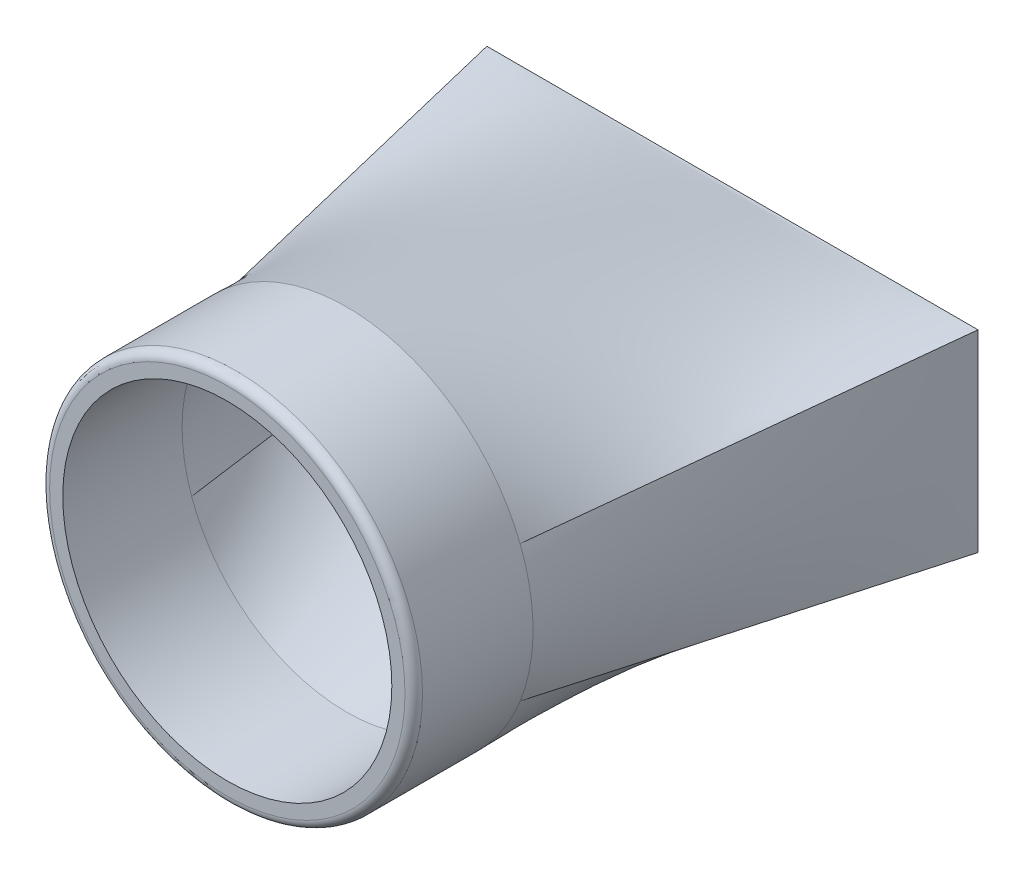
ISO-10303-21;
HEADER;
FILE_DESCRIPTION(('STEP AP214'),'2;1');
FILE_NAME('part.step','',(''),(''),'','','');
FILE_SCHEMA(('AUTOMOTIVE_DESIGN { 1 0 10303 214 1 1 1 1 }'));
ENDSEC;
DATA;
#1=APPLICATION_CONTEXT('core data for automotive mechanical design processes');
#2=APPLICATION_PROTOCOL_DEFINITION('international standard','automotive_design',2000,#1);
#3=PRODUCT_CONTEXT('',#1,'mechanical');
#4=PRODUCT('Part','Part','',(#3));
#5=PRODUCT_RELATED_PRODUCT_CATEGORY('part','',(#4));
#6=PRODUCT_DEFINITION_FORMATION('','',#4);
#7=PRODUCT_DEFINITION_CONTEXT('part definition',#1,'design');
#8=PRODUCT_DEFINITION('design','',#6,#7);
#9=PRODUCT_DEFINITION_SHAPE('','',#8);
#10=(LENGTH_UNIT() NAMED_UNIT(*) SI_UNIT(.MILLI.,.METRE.));
#11=(NAMED_UNIT(*) PLANE_ANGLE_UNIT() SI_UNIT($,.RADIAN.));
#12=(NAMED_UNIT(*) SI_UNIT($,.STERADIAN.) SOLID_ANGLE_UNIT());
#13=UNCERTAINTY_MEASURE_WITH_UNIT(LENGTH_MEASURE(1.E-05),#10,'distance_accuracy_value','');
#14=(GEOMETRIC_REPRESENTATION_CONTEXT(3) GLOBAL_UNCERTAINTY_ASSIGNED_CONTEXT((#13)) GLOBAL_UNIT_ASSIGNED_CONTEXT((#10,
#11,#12)) REPRESENTATION_CONTEXT('',''));
#15=CARTESIAN_POINT('',(0.,0.,0.));
#16=DIRECTION('',(0.,0.,1.));
#17=DIRECTION('',(1.,0.,0.));
#18=AXIS2_PLACEMENT_3D('',#15,#16,#17);
#19=CARTESIAN_POINT('',(0.,0.,-110.));
#20=DIRECTION('',(0.,0.,1.));
#21=DIRECTION('',(1.,0.,0.));
#22=AXIS2_PLACEMENT_3D('',#19,#20,#21);
#23=PLANE('',#22);
#24=CARTESIAN_POINT('',(-68.,0.,-110.));
#25=DIRECTION('',(0.,0.,-1.));
#26=DIRECTION('',(-1.,0.,0.));
#27=AXIS2_PLACEMENT_3D('',#24,#25,#26);
#28=CIRCLE('',#27,1.025);
#29=CARTESIAN_POINT('',(-69.025,0.,-110.));
#30=VERTEX_POINT('',#29);
#31=EDGE_CURVE('E597',#30,#30,#28,.T.);
#32=ORIENTED_EDGE('',*,*,#31,.F.);
#33=EDGE_LOOP('',(#32));
#34=FACE_BOUND('',#33,.T.);
#35=DIRECTION('',(0.,-1.,0.));
#36=VECTOR('',#35,1.);
#37=CARTESIAN_POINT('',(66.,23.5,-110.));
#38=LINE('',#37,#36);
#39=CARTESIAN_POINT('',(66.,23.5,-110.));
#40=VERTEX_POINT('',#39);
#41=CARTESIAN_POINT('',(66.,-23.5,-110.));
#42=VERTEX_POINT('',#41);
#43=EDGE_CURVE('E295',#40,#42,#38,.T.);
#44=ORIENTED_EDGE('',*,*,#43,.F.);
#45=DIRECTION('',(1.,0.,0.));
#46=VECTOR('',#45,1.);
#47=CARTESIAN_POINT('',(66.,23.5,-110.));
#48=LINE('',#47,#46);
#49=CARTESIAN_POINT('',(-66.,23.5,-110.));
#50=VERTEX_POINT('',#49);
#51=EDGE_CURVE('E403',#50,#40,#48,.T.);
#52=ORIENTED_EDGE('',*,*,#51,.F.);
#53=DIRECTION('',(0.,1.,0.));
#54=VECTOR('',#53,1.);
#55=CARTESIAN_POINT('',(-66.,23.5,-110.));
#56=LINE('',#55,#54);
#57=CARTESIAN_POINT('',(-66.,-23.5,-110.));
#58=VERTEX_POINT('',#57);
#59=EDGE_CURVE('E353',#58,#50,#56,.T.);
#60=ORIENTED_EDGE('',*,*,#59,.F.);
#61=DIRECTION('',(-1.,0.,0.));
#62=VECTOR('',#61,1.);
#63=CARTESIAN_POINT('',(66.,-23.5,-110.));
#64=LINE('',#63,#62);
#65=EDGE_CURVE('E306',#42,#58,#64,.T.);
#66=ORIENTED_EDGE('',*,*,#65,.F.);
#67=EDGE_LOOP('',(#44,#52,#60,#66));
#68=FACE_BOUND('',#67,.T.);
#69=DIRECTION('',(0.,1.,0.));
#70=VECTOR('',#69,1.);
#71=CARTESIAN_POINT('',(70.,27.5,-110.));
#72=LINE('',#71,#70);
#73=CARTESIAN_POINT('',(70.,-27.5,-110.));
#74=VERTEX_POINT('',#73);
#75=CARTESIAN_POINT('',(70.,27.5,-110.));
#76=VERTEX_POINT('',#75);
#77=EDGE_CURVE('E200',#74,#76,#72,.T.);
#78=ORIENTED_EDGE('',*,*,#77,.F.);
#79=DIRECTION('',(1.,0.,0.));
#80=VECTOR('',#79,1.);
#81=CARTESIAN_POINT('',(-70.,-27.5,-110.));
#82=LINE('',#81,#80);
#83=CARTESIAN_POINT('',(-70.,-27.5,-110.));
#84=VERTEX_POINT('',#83);
#85=EDGE_CURVE('E463',#84,#74,#82,.T.);
#86=ORIENTED_EDGE('',*,*,#85,.F.);
#87=DIRECTION('',(0.,-1.,0.));
#88=VECTOR('',#87,1.);
#89=CARTESIAN_POINT('',(-70.,27.5,-110.));
#90=LINE('',#89,#88);
#91=CARTESIAN_POINT('',(-70.,27.5,-110.));
#92=VERTEX_POINT('',#91);
#93=EDGE_CURVE('E466',#92,#84,#90,.T.);
#94=ORIENTED_EDGE('',*,*,#93,.F.);
#95=DIRECTION('',(-1.,0.,0.));
#96=VECTOR('',#95,1.);
#97=CARTESIAN_POINT('',(-70.,27.5,-110.));
#98=LINE('',#97,#96);
#99=EDGE_CURVE('E557',#76,#92,#98,.T.);
#100=ORIENTED_EDGE('',*,*,#99,.F.);
#101=EDGE_LOOP('',(#78,#86,#94,#100));
#102=FACE_BOUND('',#101,.T.);
#103=CARTESIAN_POINT('',(68.,-0.0100763748520707,-110.));
#104=DIRECTION('',(0.,0.,-1.));
#105=DIRECTION('',(-1.,0.,0.));
#106=AXIS2_PLACEMENT_3D('',#103,#104,#105);
#107=CIRCLE('',#106,1.025);
#108=CARTESIAN_POINT('',(66.975,-0.0100763748520707,-110.));
#109=VERTEX_POINT('',#108);
#110=EDGE_CURVE('E609',#109,#109,#107,.T.);
#111=ORIENTED_EDGE('',*,*,#110,.F.);
#112=EDGE_LOOP('',(#111));
#113=FACE_BOUND('',#112,.T.);
#114=ADVANCED_FACE('F104',(#34,#68,#102,#113),#23,.F.);
#115=CARTESIAN_POINT('',(-70.,27.5,-110.));
#116=CARTESIAN_POINT('',(-49.4694418763544,19.4344235942821,0.));
#117=CARTESIAN_POINT('',(-70.,22.9166666666667,-110.));
#118=CARTESIAN_POINT('',(-50.6538157253415,16.4196537968604,0.));
#119=CARTESIAN_POINT('',(-70.,18.3333333333333,-110.));
#120=CARTESIAN_POINT('',(-51.581145217019,13.2425985158665,0.));
#121=CARTESIAN_POINT('',(-70.,9.16666666666667,-110.));
#122=CARTESIAN_POINT('',(-52.8295129331014,6.70995682571048,0.));
#123=CARTESIAN_POINT('',(-70.,4.58333333333334,-110.));
#124=CARTESIAN_POINT('',(-53.15,3.35524339621296,0.));
#125=CARTESIAN_POINT('',(-70.,-4.58333333333333,-110.));
#126=CARTESIAN_POINT('',(-53.15,-3.35524339621295,0.));
#127=CARTESIAN_POINT('',(-70.,-9.16666666666666,-110.));
#128=CARTESIAN_POINT('',(-52.8295129331014,-6.70995682571047,0.));
#129=CARTESIAN_POINT('',(-70.,-18.3333333333333,-110.));
#130=CARTESIAN_POINT('',(-51.581145217019,-13.2425985158665,0.));
#131=CARTESIAN_POINT('',(-70.,-22.9166666666667,-110.));
#132=CARTESIAN_POINT('',(-50.6538157253416,-16.4196537968604,0.));
#133=CARTESIAN_POINT('',(-70.,-27.5,-110.));
#134=CARTESIAN_POINT('',(-49.4694418763545,-19.4344235942821,0.));
#135=B_SPLINE_SURFACE_WITH_KNOTS('',3,1,((#115,#116),(#117,#118),(#119,#120),(#121,#122),(#123,
#124),(#125,#126),(#127,#128),(#129,#130),(#131,#132),(#133,#134)),.UNSPECIFIED.,.F.,.F.,.F.,(4,
2,2,2,4),(2,2),(0.,0.25,0.5,0.75,1.),(0.,1.),.UNSPECIFIED.);
#136=DIRECTION('',(0.182998393222271,0.0718922259087497,0.980481053326352));
#137=VECTOR('',#136,1.);
#138=CARTESIAN_POINT('',(-59.7347209381772,-23.467211797141,-55.));
#139=LINE('',#138,#137);
#140=CARTESIAN_POINT('',(-49.4694796122722,-19.4344384310812,0.));
#141=VERTEX_POINT('',#140);
#142=EDGE_CURVE('E481',#84,#141,#139,.T.);
#143=CARTESIAN_POINT('',(0.,0.,0.));
#144=DIRECTION('',(0.,0.,1.));
#145=DIRECTION('',(1.,0.,0.));
#146=AXIS2_PLACEMENT_3D('',#143,#144,#145);
#147=CIRCLE('',#146,53.15);
#148=CARTESIAN_POINT('',(-49.4694701355687,19.4344347041715,0.));
#149=VERTEX_POINT('',#148);
#150=EDGE_CURVE('E188',#149,#141,#147,.T.);
#151=DIRECTION('',(-0.182998393222272,0.0718922259087497,-0.980481053326352));
#152=VECTOR('',#151,1.);
#153=CARTESIAN_POINT('',(-59.7347209381772,23.4672117971411,-55.));
#154=LINE('',#153,#152);
#155=EDGE_CURVE('E183',#149,#92,#154,.T.);
#156=ORIENTED_EDGE('',*,*,#93,.T.);
#157=ORIENTED_EDGE('',*,*,#142,.T.);
#158=ORIENTED_EDGE('',*,*,#150,.F.);
#159=ORIENTED_EDGE('',*,*,#155,.T.);
#160=EDGE_LOOP('',(#156,#157,#158,#159));
#161=FACE_BOUND('',#160,.T.);
#162=ADVANCED_FACE('F524',(#161),#135,.T.);
#163=CARTESIAN_POINT('',(-70.,-27.5,-110.));
#164=CARTESIAN_POINT('',(-49.4694418763545,-19.4344235942821,0.));
#165=CARTESIAN_POINT('',(-67.0833333333333,-27.5,-110.));
#166=CARTESIAN_POINT('',(-48.715749426999,-21.3529134653686,0.));
#167=CARTESIAN_POINT('',(-64.1666666666666,-27.5,-110.));
#168=CARTESIAN_POINT('',(-47.8203649167358,-23.3043698347779,0.));
#169=CARTESIAN_POINT('',(-58.3333333333333,-27.5,-110.));
#170=CARTESIAN_POINT('',(-45.7034991428238,-27.2226214804488,0.));
#171=CARTESIAN_POINT('',(-55.4166666666666,-27.5,-110.));
#172=CARTESIAN_POINT('',(-44.4817645940356,-29.1894358909936,0.));
#173=CARTESIAN_POINT('',(-49.5833333333333,-27.5,-110.));
#174=CARTESIAN_POINT('',(-41.6782699206312,-33.069205697395,0.));
#175=CARTESIAN_POINT('',(-46.6666666666666,-27.5,-110.));
#176=CARTESIAN_POINT('',(-40.0962104926004,-34.9820633380375,0.));
#177=CARTESIAN_POINT('',(-40.8333333333333,-27.5,-110.));
#178=CARTESIAN_POINT('',(-36.5557048653935,-38.6669276391031,0.));
#179=CARTESIAN_POINT('',(-37.9166666666666,-27.5,-110.));
#180=CARTESIAN_POINT('',(-34.5969747865321,-40.4386780490378,0.));
#181=CARTESIAN_POINT('',(-32.0833333333333,-27.5,-110.));
#182=CARTESIAN_POINT('',(-30.3133612054827,-43.7417132627383,0.));
#183=CARTESIAN_POINT('',(-29.1666666666666,-27.5,-110.));
#184=CARTESIAN_POINT('',(-27.9883047748303,-45.2725796154112,0.));
#185=CARTESIAN_POINT('',(-23.3333333333332,-27.5,-110.));
#186=CARTESIAN_POINT('',(-23.0161148534816,-47.9917714431743,0.));
#187=CARTESIAN_POINT('',(-20.4166666666666,-27.5,-110.));
#188=CARTESIAN_POINT('',(-20.3690208122345,-49.1795785792371,0.));
#189=CARTESIAN_POINT('',(-14.5833333333333,-27.5,-110.));
#190=CARTESIAN_POINT('',(-14.8330524733725,-51.1224853895306,0.));
#191=CARTESIAN_POINT('',(-11.6666666666666,-27.5,-110.));
#192=CARTESIAN_POINT('',(-11.9444855392448,-51.8770978973981,0.));
#193=CARTESIAN_POINT('',(-5.83333333333325,-27.5,-110.));
#194=CARTESIAN_POINT('',(-6.03702601914696,-52.8910043192375,0.));
#195=CARTESIAN_POINT('',(-2.9166666666666,-27.5,-110.));
#196=CARTESIAN_POINT('',(-3.01866973831855,-53.15,0.));
#197=CARTESIAN_POINT('',(2.91666666666674,-27.5,-110.));
#198=CARTESIAN_POINT('',(3.01866973831853,-53.15,0.));
#199=CARTESIAN_POINT('',(5.83333333333342,-27.5,-110.));
#200=CARTESIAN_POINT('',(6.03702601914695,-52.8910043192375,0.));
#201=CARTESIAN_POINT('',(11.6666666666668,-27.5,-110.));
#202=CARTESIAN_POINT('',(11.9444855392448,-51.8770978973982,0.));
#203=CARTESIAN_POINT('',(14.5833333333334,-27.5,-110.));
#204=CARTESIAN_POINT('',(14.8330524733724,-51.1224853895306,0.));
#205=CARTESIAN_POINT('',(20.4166666666668,-27.5,-110.));
#206=CARTESIAN_POINT('',(20.3690208122345,-49.179578579237,0.));
#207=CARTESIAN_POINT('',(23.3333333333334,-27.5,-110.));
#208=CARTESIAN_POINT('',(23.0161148534816,-47.9917714431743,0.));
#209=CARTESIAN_POINT('',(29.1666666666668,-27.5,-110.));
#210=CARTESIAN_POINT('',(27.9883047748303,-45.2725796154112,0.));
#211=CARTESIAN_POINT('',(32.0833333333334,-27.5,-110.));
#212=CARTESIAN_POINT('',(30.3133612054827,-43.7417132627383,0.));
#213=CARTESIAN_POINT('',(37.9166666666668,-27.5,-110.));
#214=CARTESIAN_POINT('',(34.5969747865321,-40.4386780490378,0.));
#215=CARTESIAN_POINT('',(40.8333333333334,-27.5,-110.));
#216=CARTESIAN_POINT('',(36.5557048653935,-38.6669276391031,0.));
#217=CARTESIAN_POINT('',(46.6666666666667,-27.5,-110.));
#218=CARTESIAN_POINT('',(40.0962104926004,-34.9820633380376,0.));
#219=CARTESIAN_POINT('',(49.5833333333334,-27.5,-110.));
#220=CARTESIAN_POINT('',(41.6782699206312,-33.069205697395,0.));
#221=CARTESIAN_POINT('',(55.4166666666667,-27.5,-110.));
#222=CARTESIAN_POINT('',(44.4817645940355,-29.1894358909936,0.));
#223=CARTESIAN_POINT('',(58.3333333333334,-27.5,-110.));
#224=CARTESIAN_POINT('',(45.7034991428238,-27.2226214804488,0.));
#225=CARTESIAN_POINT('',(64.1666666666667,-27.5,-110.));
#226=CARTESIAN_POINT('',(47.8203649167359,-23.304369834778,0.));
#227=CARTESIAN_POINT('',(67.0833333333334,-27.5,-110.));
#228=CARTESIAN_POINT('',(48.715749426999,-21.3529134653687,0.));
#229=CARTESIAN_POINT('',(70.,-27.5,-110.));
#230=CARTESIAN_POINT('',(49.4694418763544,-19.4344235942821,0.));
#231=B_SPLINE_SURFACE_WITH_KNOTS('',3,1,((#163,#164),(#165,#166),(#167,#168),(#169,#170),(#171,
#172),(#173,#174),(#175,#176),(#177,#178),(#179,#180),(#181,#182),(#183,#184),(#185,#186),(#187,
#188),(#189,#190),(#191,#192),(#193,#194),(#195,#196),(#197,#198),(#199,#200),(#201,#202),(#203,
#204),(#205,#206),(#207,#208),(#209,#210),(#211,#212),(#213,#214),(#215,#216),(#217,#218),(#219,
#220),(#221,#222),(#223,#224),(#225,#226),(#227,#228),(#229,#230)),.UNSPECIFIED.,.F.,.F.,.F.,(4,
2,2,2,2,2,2,2,2,2,2,2,2,2,2,2,4),(2,2),(0.,0.0625,0.125,0.1875,0.25,0.3125,0.375,0.4375,0.5,
0.5625,0.625,0.6875,0.75,0.8125,0.875,0.9375,1.),(0.,1.),.UNSPECIFIED.);
#232=DIRECTION('',(-0.182998393222272,0.0718922259087496,0.980481053326352));
#233=VECTOR('',#232,1.);
#234=CARTESIAN_POINT('',(59.7347209381772,-23.4672117971411,-55.));
#235=LINE('',#234,#233);
#236=CARTESIAN_POINT('',(49.4694701355686,-19.4344347041715,0.));
#237=VERTEX_POINT('',#236);
#238=EDGE_CURVE('E202',#74,#237,#235,.T.);
#239=EDGE_CURVE('E207',#141,#237,#147,.T.);
#240=ORIENTED_EDGE('',*,*,#85,.T.);
#241=ORIENTED_EDGE('',*,*,#238,.T.);
#242=ORIENTED_EDGE('',*,*,#239,.F.);
#243=ORIENTED_EDGE('',*,*,#142,.F.);
#244=EDGE_LOOP('',(#240,#241,#242,#243));
#245=FACE_BOUND('',#244,.T.);
#246=ADVANCED_FACE('F479',(#245),#231,.T.);
#247=CARTESIAN_POINT('',(70.,27.5,-110.));
#248=CARTESIAN_POINT('',(49.4694418763544,19.4344235942821,0.));
#249=CARTESIAN_POINT('',(67.0833333333333,27.5,-110.));
#250=CARTESIAN_POINT('',(48.715749426999,21.3529134653687,0.));
#251=CARTESIAN_POINT('',(64.1666666666666,27.5,-110.));
#252=CARTESIAN_POINT('',(47.8203649167358,23.304369834778,0.));
#253=CARTESIAN_POINT('',(58.3333333333332,27.5,-110.));
#254=CARTESIAN_POINT('',(45.7034991428238,27.2226214804488,0.));
#255=CARTESIAN_POINT('',(55.4166666666665,27.5,-110.));
#256=CARTESIAN_POINT('',(44.4817645940355,29.1894358909936,0.));
#257=CARTESIAN_POINT('',(49.5833333333331,27.5,-110.));
#258=CARTESIAN_POINT('',(41.6782699206312,33.0692056973951,0.));
#259=CARTESIAN_POINT('',(46.6666666666664,27.5,-110.));
#260=CARTESIAN_POINT('',(40.0962104926004,34.9820633380376,0.));
#261=CARTESIAN_POINT('',(40.8333333333331,27.5,-110.));
#262=CARTESIAN_POINT('',(36.5557048653935,38.6669276391031,0.));
#263=CARTESIAN_POINT('',(37.9166666666664,27.5,-110.));
#264=CARTESIAN_POINT('',(34.5969747865321,40.4386780490378,0.));
#265=CARTESIAN_POINT('',(32.083333333333,27.5,-110.));
#266=CARTESIAN_POINT('',(30.3133612054827,43.7417132627383,0.));
#267=CARTESIAN_POINT('',(29.1666666666663,27.5,-110.));
#268=CARTESIAN_POINT('',(27.9883047748303,45.2725796154112,0.));
#269=CARTESIAN_POINT('',(23.3333333333329,27.5,-110.));
#270=CARTESIAN_POINT('',(23.0161148534816,47.9917714431743,0.));
#271=CARTESIAN_POINT('',(20.4166666666662,27.5,-110.));
#272=CARTESIAN_POINT('',(20.3690208122345,49.1795785792371,0.));
#273=CARTESIAN_POINT('',(14.5833333333329,27.5,-110.));
#274=CARTESIAN_POINT('',(14.8330524733724,51.1224853895306,0.));
#275=CARTESIAN_POINT('',(11.6666666666662,27.5,-110.));
#276=CARTESIAN_POINT('',(11.9444855392448,51.8770978973982,0.));
#277=CARTESIAN_POINT('',(5.83333333333287,27.5,-110.));
#278=CARTESIAN_POINT('',(6.03702601914695,52.8910043192375,0.));
#279=CARTESIAN_POINT('',(2.91666666666622,27.5,-110.));
#280=CARTESIAN_POINT('',(3.01866973831853,53.15,0.));
#281=CARTESIAN_POINT('',(-2.91666666666712,27.5,-110.));
#282=CARTESIAN_POINT('',(-3.01866973831853,53.15,0.));
#283=CARTESIAN_POINT('',(-5.8333333333338,27.5,-110.));
#284=CARTESIAN_POINT('',(-6.03702601914696,52.8910043192375,0.));
#285=CARTESIAN_POINT('',(-11.6666666666671,27.5,-110.));
#286=CARTESIAN_POINT('',(-11.9444855392448,51.8770978973981,0.));
#287=CARTESIAN_POINT('',(-14.5833333333338,27.5,-110.));
#288=CARTESIAN_POINT('',(-14.8330524733724,51.1224853895306,0.));
#289=CARTESIAN_POINT('',(-20.4166666666671,27.5,-110.));
#290=CARTESIAN_POINT('',(-20.3690208122345,49.179578579237,0.));
#291=CARTESIAN_POINT('',(-23.3333333333338,27.5,-110.));
#292=CARTESIAN_POINT('',(-23.0161148534816,47.9917714431743,0.));
#293=CARTESIAN_POINT('',(-29.1666666666671,27.5,-110.));
#294=CARTESIAN_POINT('',(-27.9883047748303,45.2725796154112,0.));
#295=CARTESIAN_POINT('',(-32.0833333333337,27.5,-110.));
#296=CARTESIAN_POINT('',(-30.3133612054827,43.7417132627382,0.));
#297=CARTESIAN_POINT('',(-37.916666666667,27.5,-110.));
#298=CARTESIAN_POINT('',(-34.5969747865321,40.4386780490378,0.));
#299=CARTESIAN_POINT('',(-40.8333333333337,27.5,-110.));
#300=CARTESIAN_POINT('',(-36.5557048653935,38.6669276391031,0.));
#301=CARTESIAN_POINT('',(-46.666666666667,27.5,-110.));
#302=CARTESIAN_POINT('',(-40.0962104926004,34.9820633380375,0.));
#303=CARTESIAN_POINT('',(-49.5833333333336,27.5,-110.));
#304=CARTESIAN_POINT('',(-41.6782699206312,33.069205697395,0.));
#305=CARTESIAN_POINT('',(-55.4166666666669,27.5,-110.));
#306=CARTESIAN_POINT('',(-44.4817645940356,29.1894358909936,0.));
#307=CARTESIAN_POINT('',(-58.3333333333335,27.5,-110.));
#308=CARTESIAN_POINT('',(-45.7034991428238,27.2226214804488,0.));
#309=CARTESIAN_POINT('',(-64.1666666666668,27.5,-110.));
#310=CARTESIAN_POINT('',(-47.8203649167358,23.304369834778,0.));
#311=CARTESIAN_POINT('',(-67.0833333333334,27.5,-110.));
#312=CARTESIAN_POINT('',(-48.715749426999,21.3529134653687,0.));
#313=CARTESIAN_POINT('',(-70.,27.5,-110.));
#314=CARTESIAN_POINT('',(-49.4694418763544,19.4344235942821,0.));
#315=B_SPLINE_SURFACE_WITH_KNOTS('',3,1,((#247,#248),(#249,#250),(#251,#252),(#253,#254),(#255,
#256),(#257,#258),(#259,#260),(#261,#262),(#263,#264),(#265,#266),(#267,#268),(#269,#270),(#271,
#272),(#273,#274),(#275,#276),(#277,#278),(#279,#280),(#281,#282),(#283,#284),(#285,#286),(#287,
#288),(#289,#290),(#291,#292),(#293,#294),(#295,#296),(#297,#298),(#299,#300),(#301,#302),(#303,
#304),(#305,#306),(#307,#308),(#309,#310),(#311,#312),(#313,#314)),.UNSPECIFIED.,.F.,.F.,.F.,(4,
2,2,2,2,2,2,2,2,2,2,2,2,2,2,2,4),(2,2),(0.,0.0625,0.125,0.1875,0.25,0.3125,0.375,0.4375,0.5,
0.5625,0.625,0.6875,0.75,0.8125,0.875000000000001,0.9375,1.),(0.,1.),.UNSPECIFIED.);
#316=CARTESIAN_POINT('',(49.4694796122712,19.4344384310807,0.));
#317=VERTEX_POINT('',#316);
#318=EDGE_CURVE('E177',#317,#149,#147,.T.);
#319=DIRECTION('',(-0.182998393222272,-0.0718922259087497,0.980481053326352));
#320=VECTOR('',#319,1.);
#321=CARTESIAN_POINT('',(59.7347209381772,23.467211797141,-55.));
#322=LINE('',#321,#320);
#323=EDGE_CURVE('E182',#76,#317,#322,.T.);
#324=ORIENTED_EDGE('',*,*,#99,.T.);
#325=ORIENTED_EDGE('',*,*,#155,.F.);
#326=ORIENTED_EDGE('',*,*,#318,.F.);
#327=ORIENTED_EDGE('',*,*,#323,.F.);
#328=EDGE_LOOP('',(#324,#325,#326,#327));
#329=FACE_BOUND('',#328,.T.);
#330=ADVANCED_FACE('F181',(#329),#315,.T.);
#331=CARTESIAN_POINT('',(70.,-27.5,-110.));
#332=CARTESIAN_POINT('',(49.4694418763544,-19.4344235942821,0.));
#333=CARTESIAN_POINT('',(70.,-22.9166666666667,-110.));
#334=CARTESIAN_POINT('',(50.6538157253416,-16.4196537968604,0.));
#335=CARTESIAN_POINT('',(70.,-18.3333333333333,-110.));
#336=CARTESIAN_POINT('',(51.581145217019,-13.2425985158665,0.));
#337=CARTESIAN_POINT('',(70.,-9.16666666666667,-110.));
#338=CARTESIAN_POINT('',(52.8295129331014,-6.70995682571049,0.));
#339=CARTESIAN_POINT('',(70.,-4.58333333333334,-110.));
#340=CARTESIAN_POINT('',(53.15,-3.35524339621297,0.));
#341=CARTESIAN_POINT('',(70.,4.58333333333333,-110.));
#342=CARTESIAN_POINT('',(53.15,3.35524339621295,0.));
#343=CARTESIAN_POINT('',(70.,9.16666666666666,-110.));
#344=CARTESIAN_POINT('',(52.8295129331014,6.70995682571048,0.));
#345=CARTESIAN_POINT('',(70.,18.3333333333333,-110.));
#346=CARTESIAN_POINT('',(51.581145217019,13.2425985158665,0.));
#347=CARTESIAN_POINT('',(70.,22.9166666666667,-110.));
#348=CARTESIAN_POINT('',(50.6538157253416,16.4196537968604,0.));
#349=CARTESIAN_POINT('',(70.,27.5,-110.));
#350=CARTESIAN_POINT('',(49.4694418763545,19.4344235942821,0.));
#351=B_SPLINE_SURFACE_WITH_KNOTS('',3,1,((#331,#332),(#333,#334),(#335,#336),(#337,#338),(#339,
#340),(#341,#342),(#343,#344),(#345,#346),(#347,#348),(#349,#350)),.UNSPECIFIED.,.F.,.F.,.F.,(4,
2,2,2,4),(2,2),(0.,0.25,0.5,0.75,1.),(0.,1.),.UNSPECIFIED.);
#352=EDGE_CURVE('E196',#237,#317,#147,.T.);
#353=ORIENTED_EDGE('',*,*,#77,.T.);
#354=ORIENTED_EDGE('',*,*,#323,.T.);
#355=ORIENTED_EDGE('',*,*,#352,.F.);
#356=ORIENTED_EDGE('',*,*,#238,.F.);
#357=EDGE_LOOP('',(#353,#354,#355,#356));
#358=FACE_BOUND('',#357,.T.);
#359=ADVANCED_FACE('F194',(#358),#351,.T.);
#360=CARTESIAN_POINT('',(-44.1828209210819,15.7317619946276,0.));
#361=CARTESIAN_POINT('',(-66.,23.5,-110.));
#362=CARTESIAN_POINT('',(-43.5653070413895,17.4660562950402,0.));
#363=CARTESIAN_POINT('',(-63.25,23.5,-110.));
#364=CARTESIAN_POINT('',(-42.8198879921213,19.2367598429358,0.));
#365=CARTESIAN_POINT('',(-60.5,23.5,-110.));
#366=CARTESIAN_POINT('',(-41.0302158469997,22.8060764810876,0.));
#367=CARTESIAN_POINT('',(-55.,23.5,-110.));
#368=CARTESIAN_POINT('',(-39.9857143500419,24.6047313020867,0.));
#369=CARTESIAN_POINT('',(-52.25,23.5,-110.));
#370=CARTESIAN_POINT('',(-37.5619501680592,28.166470387737,0.));
#371=CARTESIAN_POINT('',(-46.75,23.5,-110.));
#372=CARTESIAN_POINT('',(-36.1823800941899,29.9294821051109,0.));
#373=CARTESIAN_POINT('',(-44.,23.5,-110.));
#374=CARTESIAN_POINT('',(-33.0684359625425,33.3379224210479,0.));
#375=CARTESIAN_POINT('',(-38.5,23.5,-110.));
#376=CARTESIAN_POINT('',(-31.3337553659899,34.9831133069227,0.));
#377=CARTESIAN_POINT('',(-35.75,23.5,-110.));
#378=CARTESIAN_POINT('',(-27.514919902713,38.0598426787078,0.));
#379=CARTESIAN_POINT('',(-30.25,23.5,-110.));
#380=CARTESIAN_POINT('',(-25.4305610564765,39.4909643815665,0.));
#381=CARTESIAN_POINT('',(-27.5,23.5,-110.));
#382=CARTESIAN_POINT('',(-20.9511585365002,42.0392514135513,0.));
#383=CARTESIAN_POINT('',(-22.,23.5,-110.));
#384=CARTESIAN_POINT('',(-18.5561289691143,43.1558794225034,0.));
#385=CARTESIAN_POINT('',(-19.25,23.5,-110.));
#386=CARTESIAN_POINT('',(-13.5309174970144,44.985265618167,0.));
#387=CARTESIAN_POINT('',(-13.75,23.5,-110.));
#388=CARTESIAN_POINT('',(-10.9010380078971,45.6975059234933,0.));
#389=CARTESIAN_POINT('',(-11.,23.5,-110.));
#390=CARTESIAN_POINT('',(-5.51384493361766,46.6550339333854,0.));
#391=CARTESIAN_POINT('',(-5.50000000000003,23.5,-110.));
#392=CARTESIAN_POINT('',(-2.75708660058732,46.9,0.));
#393=CARTESIAN_POINT('',(-2.75000000000003,23.5,-110.));
#394=CARTESIAN_POINT('',(2.75708660058731,46.9,0.));
#395=CARTESIAN_POINT('',(2.74999999999997,23.5,-110.));
#396=CARTESIAN_POINT('',(5.51384493361766,46.6550339333854,0.));
#397=CARTESIAN_POINT('',(5.49999999999997,23.5,-110.));
#398=CARTESIAN_POINT('',(10.9010380078971,45.6975059234933,0.));
#399=CARTESIAN_POINT('',(11.,23.5,-110.));
#400=CARTESIAN_POINT('',(13.5309174970144,44.985265618167,0.));
#401=CARTESIAN_POINT('',(13.75,23.5,-110.));
#402=CARTESIAN_POINT('',(18.5561289691143,43.1558794225034,0.));
#403=CARTESIAN_POINT('',(19.25,23.5,-110.));
#404=CARTESIAN_POINT('',(20.9511585365002,42.0392514135513,0.));
#405=CARTESIAN_POINT('',(22.,23.5,-110.));
#406=CARTESIAN_POINT('',(25.4305610564765,39.4909643815665,0.));
#407=CARTESIAN_POINT('',(27.5,23.5,-110.));
#408=CARTESIAN_POINT('',(27.514919902713,38.0598426787078,0.));
#409=CARTESIAN_POINT('',(30.25,23.5,-110.));
#410=CARTESIAN_POINT('',(31.3337553659899,34.9831133069227,0.));
#411=CARTESIAN_POINT('',(35.75,23.5,-110.));
#412=CARTESIAN_POINT('',(33.0684359625425,33.3379224210479,0.));
#413=CARTESIAN_POINT('',(38.5,23.5,-110.));
#414=CARTESIAN_POINT('',(36.1823800941899,29.9294821051109,0.));
#415=CARTESIAN_POINT('',(44.,23.5,-110.));
#416=CARTESIAN_POINT('',(37.5619501680592,28.166470387737,0.));
#417=CARTESIAN_POINT('',(46.75,23.5,-110.));
#418=CARTESIAN_POINT('',(39.9857143500419,24.6047313020867,0.));
#419=CARTESIAN_POINT('',(52.25,23.5,-110.));
#420=CARTESIAN_POINT('',(41.0302158469997,22.8060764810876,0.));
#421=CARTESIAN_POINT('',(55.,23.5,-110.));
#422=CARTESIAN_POINT('',(42.8198879921213,19.2367598429358,0.));
#423=CARTESIAN_POINT('',(60.5,23.5,-110.));
#424=CARTESIAN_POINT('',(43.5653070413895,17.4660562950402,0.));
#425=CARTESIAN_POINT('',(63.25,23.5,-110.));
#426=CARTESIAN_POINT('',(44.1828209210819,15.7317619946276,0.));
#427=CARTESIAN_POINT('',(66.,23.5,-110.));
#428=B_SPLINE_SURFACE_WITH_KNOTS('',3,1,((#360,#361),(#362,#363),(#364,#365),(#366,#367),(#368,
#369),(#370,#371),(#372,#373),(#374,#375),(#376,#377),(#378,#379),(#380,#381),(#382,#383),(#384,
#385),(#386,#387),(#388,#389),(#390,#391),(#392,#393),(#394,#395),(#396,#397),(#398,#399),(#400,
#401),(#402,#403),(#404,#405),(#406,#407),(#408,#409),(#410,#411),(#412,#413),(#414,#415),(#416,
#417),(#418,#419),(#420,#421),(#422,#423),(#424,#425),(#426,#427)),.UNSPECIFIED.,.F.,.F.,.F.,(4,
2,2,2,2,2,2,2,2,2,2,2,2,2,2,2,4),(2,2),(0.,0.0625000000000001,0.125,0.1875,0.25,0.3125,0.375,
0.4375,0.5,0.5625,0.625,0.6875,0.75,0.8125,0.875,0.9375,1.),(0.,1.),.UNSPECIFIED.);
#429=CARTESIAN_POINT('',(0.,0.,0.));
#430=DIRECTION('',(0.,0.,1.));
#431=DIRECTION('',(1.,0.,0.));
#432=AXIS2_PLACEMENT_3D('',#429,#430,#431);
#433=CIRCLE('',#432,46.9);
#434=CARTESIAN_POINT('',(44.1829650016032,15.7318133829644,0.));
#435=VERTEX_POINT('',#434);
#436=CARTESIAN_POINT('',(-44.1829779517147,15.731817999296,0.));
#437=VERTEX_POINT('',#436);
#438=EDGE_CURVE('E357',#435,#437,#433,.T.);
#439=DIRECTION('',(0.194083240147248,-0.0691053961130353,0.978547975380873));
#440=VECTOR('',#439,1.);
#441=CARTESIAN_POINT('',(-55.0914104605409,19.6158809973138,-55.));
#442=LINE('',#441,#440);
#443=EDGE_CURVE('E359',#50,#437,#442,.T.);
#444=DIRECTION('',(0.194083240147248,0.0691053961130352,-0.978547975380873));
#445=VECTOR('',#444,1.);
#446=CARTESIAN_POINT('',(55.0914104605409,19.6158809973138,-55.));
#447=LINE('',#446,#445);
#448=EDGE_CURVE('E349',#435,#40,#447,.T.);
#449=ORIENTED_EDGE('',*,*,#438,.T.);
#450=ORIENTED_EDGE('',*,*,#443,.F.);
#451=ORIENTED_EDGE('',*,*,#51,.T.);
#452=ORIENTED_EDGE('',*,*,#448,.F.);
#453=EDGE_LOOP('',(#449,#450,#451,#452));
#454=FACE_BOUND('',#453,.T.);
#455=ADVANCED_FACE('F257',(#454),#428,.F.);
#456=CARTESIAN_POINT('',(44.1828209210819,15.7317619946276,0.));
#457=CARTESIAN_POINT('',(66.,23.5,-110.));
#458=CARTESIAN_POINT('',(45.0623103860983,13.2617064758582,0.));
#459=CARTESIAN_POINT('',(66.,19.5833333333333,-110.));
#460=CARTESIAN_POINT('',(45.7461256000594,10.6810771704032,0.));
#461=CARTESIAN_POINT('',(66.,15.6666666666667,-110.));
#462=CARTESIAN_POINT('',(46.6651128414054,5.40006115108209,0.));
#463=CARTESIAN_POINT('',(66.,7.83333333333332,-110.));
#464=CARTESIAN_POINT('',(46.9,2.70017854844188,0.));
#465=CARTESIAN_POINT('',(66.,3.91666666666665,-110.));
#466=CARTESIAN_POINT('',(46.9,-2.70017854844189,0.));
#467=CARTESIAN_POINT('',(66.,-3.91666666666668,-110.));
#468=CARTESIAN_POINT('',(46.6651128414053,-5.4000611510821,0.));
#469=CARTESIAN_POINT('',(66.,-7.83333333333334,-110.));
#470=CARTESIAN_POINT('',(45.7461256000594,-10.6810771704032,0.));
#471=CARTESIAN_POINT('',(66.,-15.6666666666667,-110.));
#472=CARTESIAN_POINT('',(45.0623103860982,-13.2617064758582,0.));
#473=CARTESIAN_POINT('',(66.,-19.5833333333333,-110.));
#474=CARTESIAN_POINT('',(44.1828209210819,-15.7317619946276,0.));
#475=CARTESIAN_POINT('',(66.,-23.5,-110.));
#476=B_SPLINE_SURFACE_WITH_KNOTS('',3,1,((#456,#457),(#458,#459),(#460,#461),(#462,#463),(#464,
#465),(#466,#467),(#468,#469),(#470,#471),(#472,#473),(#474,#475)),.UNSPECIFIED.,.F.,.F.,.F.,(4,
2,2,2,4),(2,2),(0.,0.25,0.5,0.75,1.),(0.,1.),.UNSPECIFIED.);
#477=CARTESIAN_POINT('',(44.1829779517119,-15.731817999295,0.));
#478=VERTEX_POINT('',#477);
#479=EDGE_CURVE('E362',#478,#435,#433,.T.);
#480=DIRECTION('',(0.194083240147248,-0.0691053961130353,-0.978547975380873));
#481=VECTOR('',#480,1.);
#482=CARTESIAN_POINT('',(55.0914104605409,-19.6158809973138,-55.));
#483=LINE('',#482,#481);
#484=EDGE_CURVE('E127',#478,#42,#483,.T.);
#485=ORIENTED_EDGE('',*,*,#479,.T.);
#486=ORIENTED_EDGE('',*,*,#448,.T.);
#487=ORIENTED_EDGE('',*,*,#43,.T.);
#488=ORIENTED_EDGE('',*,*,#484,.F.);
#489=EDGE_LOOP('',(#485,#486,#487,#488));
#490=FACE_BOUND('',#489,.T.);
#491=ADVANCED_FACE('F263',(#490),#476,.F.);
#492=CARTESIAN_POINT('',(-44.1828209210819,-15.7317619946276,0.));
#493=CARTESIAN_POINT('',(-66.,-23.5,-110.));
#494=CARTESIAN_POINT('',(-45.0623103860983,-13.2617064758582,0.));
#495=CARTESIAN_POINT('',(-66.,-19.5833333333333,-110.));
#496=CARTESIAN_POINT('',(-45.7461256000594,-10.6810771704032,0.));
#497=CARTESIAN_POINT('',(-66.,-15.6666666666667,-110.));
#498=CARTESIAN_POINT('',(-46.6651128414054,-5.40006115108208,0.));
#499=CARTESIAN_POINT('',(-66.,-7.83333333333333,-110.));
#500=CARTESIAN_POINT('',(-46.9,-2.70017854844187,0.));
#501=CARTESIAN_POINT('',(-66.,-3.91666666666666,-110.));
#502=CARTESIAN_POINT('',(-46.9,2.70017854844188,0.));
#503=CARTESIAN_POINT('',(-66.,3.91666666666667,-110.));
#504=CARTESIAN_POINT('',(-46.6651128414054,5.4000611510821,0.));
#505=CARTESIAN_POINT('',(-66.,7.83333333333333,-110.));
#506=CARTESIAN_POINT('',(-45.7461256000594,10.6810771704032,0.));
#507=CARTESIAN_POINT('',(-66.,15.6666666666667,-110.));
#508=CARTESIAN_POINT('',(-45.0623103860983,13.2617064758582,0.));
#509=CARTESIAN_POINT('',(-66.,19.5833333333333,-110.));
#510=CARTESIAN_POINT('',(-44.1828209210819,15.7317619946276,0.));
#511=CARTESIAN_POINT('',(-66.,23.5,-110.));
#512=B_SPLINE_SURFACE_WITH_KNOTS('',3,1,((#492,#493),(#494,#495),(#496,#497),(#498,#499),(#500,
#501),(#502,#503),(#504,#505),(#506,#507),(#508,#509),(#510,#511)),.UNSPECIFIED.,.F.,.F.,.F.,(4,
2,2,2,4),(2,2),(0.,0.25,0.5,0.75,1.),(0.,1.),.UNSPECIFIED.);
#513=CARTESIAN_POINT('',(-44.1829650016045,-15.7318133829649,0.));
#514=VERTEX_POINT('',#513);
#515=EDGE_CURVE('E363',#437,#514,#433,.T.);
#516=DIRECTION('',(-0.194083240147248,-0.0691053961130356,-0.978547975380873));
#517=VECTOR('',#516,1.);
#518=CARTESIAN_POINT('',(-55.0914104605409,-19.6158809973138,-55.));
#519=LINE('',#518,#517);
#520=EDGE_CURVE('E348',#514,#58,#519,.T.);
#521=ORIENTED_EDGE('',*,*,#515,.T.);
#522=ORIENTED_EDGE('',*,*,#520,.T.);
#523=ORIENTED_EDGE('',*,*,#59,.T.);
#524=ORIENTED_EDGE('',*,*,#443,.T.);
#525=EDGE_LOOP('',(#521,#522,#523,#524));
#526=FACE_BOUND('',#525,.T.);
#527=ADVANCED_FACE('F324',(#526),#512,.F.);
#528=CARTESIAN_POINT('',(44.1828209210819,-15.7317619946276,0.));
#529=CARTESIAN_POINT('',(66.,-23.5,-110.));
#530=CARTESIAN_POINT('',(43.5653070413895,-17.4660562950402,0.));
#531=CARTESIAN_POINT('',(63.25,-23.5,-110.));
#532=CARTESIAN_POINT('',(42.8198879921213,-19.2367598429358,0.));
#533=CARTESIAN_POINT('',(60.5,-23.5,-110.));
#534=CARTESIAN_POINT('',(41.0302158469997,-22.8060764810876,0.));
#535=CARTESIAN_POINT('',(55.,-23.5,-110.));
#536=CARTESIAN_POINT('',(39.9857143500419,-24.6047313020867,0.));
#537=CARTESIAN_POINT('',(52.25,-23.5,-110.));
#538=CARTESIAN_POINT('',(37.5619501680592,-28.166470387737,0.));
#539=CARTESIAN_POINT('',(46.75,-23.5,-110.));
#540=CARTESIAN_POINT('',(36.1823800941899,-29.9294821051109,0.));
#541=CARTESIAN_POINT('',(44.,-23.5,-110.));
#542=CARTESIAN_POINT('',(33.0684359625425,-33.3379224210479,0.));
#543=CARTESIAN_POINT('',(38.5,-23.5,-110.));
#544=CARTESIAN_POINT('',(31.3337553659899,-34.9831133069227,0.));
#545=CARTESIAN_POINT('',(35.75,-23.5,-110.));
#546=CARTESIAN_POINT('',(27.514919902713,-38.0598426787078,0.));
#547=CARTESIAN_POINT('',(30.25,-23.5,-110.));
#548=CARTESIAN_POINT('',(25.4305610564765,-39.4909643815665,0.));
#549=CARTESIAN_POINT('',(27.5,-23.5,-110.));
#550=CARTESIAN_POINT('',(20.9511585365002,-42.0392514135513,0.));
#551=CARTESIAN_POINT('',(22.,-23.5,-110.));
#552=CARTESIAN_POINT('',(18.5561289691143,-43.1558794225034,0.));
#553=CARTESIAN_POINT('',(19.25,-23.5,-110.));
#554=CARTESIAN_POINT('',(13.5309174970144,-44.985265618167,0.));
#555=CARTESIAN_POINT('',(13.75,-23.5,-110.));
#556=CARTESIAN_POINT('',(10.9010380078971,-45.6975059234933,0.));
#557=CARTESIAN_POINT('',(11.,-23.5,-110.));
#558=CARTESIAN_POINT('',(5.51384493361765,-46.6550339333854,0.));
#559=CARTESIAN_POINT('',(5.50000000000004,-23.5,-110.));
#560=CARTESIAN_POINT('',(2.7570866005873,-46.9,0.));
#561=CARTESIAN_POINT('',(2.75000000000004,-23.5,-110.));
#562=CARTESIAN_POINT('',(-2.75708660058733,-46.9,0.));
#563=CARTESIAN_POINT('',(-2.74999999999995,-23.5,-110.));
#564=CARTESIAN_POINT('',(-5.51384493361768,-46.6550339333854,0.));
#565=CARTESIAN_POINT('',(-5.49999999999995,-23.5,-110.));
#566=CARTESIAN_POINT('',(-10.9010380078971,-45.6975059234933,0.));
#567=CARTESIAN_POINT('',(-11.,-23.5,-110.));
#568=CARTESIAN_POINT('',(-13.5309174970145,-44.985265618167,0.));
#569=CARTESIAN_POINT('',(-13.75,-23.5,-110.));
#570=CARTESIAN_POINT('',(-18.5561289691143,-43.1558794225034,0.));
#571=CARTESIAN_POINT('',(-19.25,-23.5,-110.));
#572=CARTESIAN_POINT('',(-20.9511585365002,-42.0392514135513,0.));
#573=CARTESIAN_POINT('',(-22.,-23.5,-110.));
#574=CARTESIAN_POINT('',(-25.4305610564765,-39.4909643815665,0.));
#575=CARTESIAN_POINT('',(-27.5,-23.5,-110.));
#576=CARTESIAN_POINT('',(-27.514919902713,-38.0598426787078,0.));
#577=CARTESIAN_POINT('',(-30.25,-23.5,-110.));
#578=CARTESIAN_POINT('',(-31.3337553659899,-34.9831133069227,0.));
#579=CARTESIAN_POINT('',(-35.75,-23.5,-110.));
#580=CARTESIAN_POINT('',(-33.0684359625425,-33.3379224210479,0.));
#581=CARTESIAN_POINT('',(-38.5,-23.5,-110.));
#582=CARTESIAN_POINT('',(-36.1823800941899,-29.9294821051109,0.));
#583=CARTESIAN_POINT('',(-44.,-23.5,-110.));
#584=CARTESIAN_POINT('',(-37.5619501680592,-28.166470387737,0.));
#585=CARTESIAN_POINT('',(-46.75,-23.5,-110.));
#586=CARTESIAN_POINT('',(-39.9857143500419,-24.6047313020867,0.));
#587=CARTESIAN_POINT('',(-52.25,-23.5,-110.));
#588=CARTESIAN_POINT('',(-41.0302158469997,-22.8060764810876,0.));
#589=CARTESIAN_POINT('',(-55.,-23.5,-110.));
#590=CARTESIAN_POINT('',(-42.8198879921213,-19.2367598429358,0.));
#591=CARTESIAN_POINT('',(-60.5,-23.5,-110.));
#592=CARTESIAN_POINT('',(-43.5653070413895,-17.4660562950402,0.));
#593=CARTESIAN_POINT('',(-63.25,-23.5,-110.));
#594=CARTESIAN_POINT('',(-44.1828209210819,-15.7317619946276,0.));
#595=CARTESIAN_POINT('',(-66.,-23.5,-110.));
#596=B_SPLINE_SURFACE_WITH_KNOTS('',3,1,((#528,#529),(#530,#531),(#532,#533),(#534,#535),(#536,
#537),(#538,#539),(#540,#541),(#542,#543),(#544,#545),(#546,#547),(#548,#549),(#550,#551),(#552,
#553),(#554,#555),(#556,#557),(#558,#559),(#560,#561),(#562,#563),(#564,#565),(#566,#567),(#568,
#569),(#570,#571),(#572,#573),(#574,#575),(#576,#577),(#578,#579),(#580,#581),(#582,#583),(#584,
#585),(#586,#587),(#588,#589),(#590,#591),(#592,#593),(#594,#595)),.UNSPECIFIED.,.F.,.F.,.F.,(4,
2,2,2,2,2,2,2,2,2,2,2,2,2,2,2,4),(2,2),(0.,0.0625,0.125,0.1875,0.25,0.3125,0.375,0.4375,0.5,
0.5625,0.625,0.6875,0.75,0.8125,0.875,0.9375,1.),(0.,1.),.UNSPECIFIED.);
#597=EDGE_CURVE('E119',#514,#478,#433,.T.);
#598=ORIENTED_EDGE('',*,*,#597,.T.);
#599=ORIENTED_EDGE('',*,*,#484,.T.);
#600=ORIENTED_EDGE('',*,*,#65,.T.);
#601=ORIENTED_EDGE('',*,*,#520,.F.);
#602=EDGE_LOOP('',(#598,#599,#600,#601));
#603=FACE_BOUND('',#602,.T.);
#604=ADVANCED_FACE('F255',(#603),#596,.F.);
#605=CARTESIAN_POINT('',(-68.,0.,-104.));
#606=DIRECTION('',(0.,0.,-1.));
#607=DIRECTION('',(-1.,0.,0.));
#608=AXIS2_PLACEMENT_3D('',#605,#606,#607);
#609=CONICAL_SURFACE('',#608,0.799999999999995,1.02974425867664);
#610=CARTESIAN_POINT('',(-68.,0.,-103.519311504778));
#611=VERTEX_POINT('',#610);
#612=VERTEX_LOOP('',#611);
#613=FACE_BOUND('',#612,.T.);
#614=CARTESIAN_POINT('',(-68.,0.,-104.));
#615=DIRECTION('',(0.,0.,-1.));
#616=DIRECTION('',(-1.,0.,0.));
#617=AXIS2_PLACEMENT_3D('',#614,#615,#616);
#618=CIRCLE('',#617,0.799999999999995);
#619=CARTESIAN_POINT('',(-68.8,0.,-104.));
#620=VERTEX_POINT('',#619);
#621=EDGE_CURVE('E380',#620,#620,#618,.T.);
#622=ORIENTED_EDGE('',*,*,#621,.T.);
#623=EDGE_LOOP('',(#622));
#624=FACE_BOUND('',#623,.T.);
#625=ADVANCED_FACE('F251',(#613,#624),#609,.F.);
#626=CARTESIAN_POINT('',(-68.,0.,-110.));
#627=DIRECTION('',(0.,0.,-1.));
#628=DIRECTION('',(-1.,0.,0.));
#629=AXIS2_PLACEMENT_3D('',#626,#627,#628);
#630=CYLINDRICAL_SURFACE('',#629,0.799999999999995);
#631=ORIENTED_EDGE('',*,*,#621,.F.);
#632=EDGE_LOOP('',(#631));
#633=FACE_BOUND('',#632,.T.);
#634=CARTESIAN_POINT('',(-68.,0.,-109.775));
#635=DIRECTION('',(0.,0.,-1.));
#636=DIRECTION('',(-1.,0.,0.));
#637=AXIS2_PLACEMENT_3D('',#634,#635,#636);
#638=CIRCLE('',#637,0.799999999999995);
#639=CARTESIAN_POINT('',(-68.8,0.,-109.775));
#640=VERTEX_POINT('',#639);
#641=EDGE_CURVE('E599',#640,#640,#638,.T.);
#642=ORIENTED_EDGE('',*,*,#641,.T.);
#643=EDGE_LOOP('',(#642));
#644=FACE_BOUND('',#643,.T.);
#645=ADVANCED_FACE('F247',(#633,#644),#630,.F.);
#646=CARTESIAN_POINT('',(-68.,0.,-110.));
#647=DIRECTION('',(0.,0.,-1.));
#648=DIRECTION('',(-1.,0.,0.));
#649=AXIS2_PLACEMENT_3D('',#646,#647,#648);
#650=CONICAL_SURFACE('',#649,1.025,0.785398163397448);
#651=ORIENTED_EDGE('',*,*,#641,.F.);
#652=EDGE_LOOP('',(#651));
#653=FACE_BOUND('',#652,.T.);
#654=ORIENTED_EDGE('',*,*,#31,.T.);
#655=EDGE_LOOP('',(#654));
#656=FACE_BOUND('',#655,.T.);
#657=ADVANCED_FACE('F243',(#653,#656),#650,.F.);
#658=CARTESIAN_POINT('',(68.,-0.0100763748520707,-104.));
#659=DIRECTION('',(0.,0.,-1.));
#660=DIRECTION('',(-1.,0.,0.));
#661=AXIS2_PLACEMENT_3D('',#658,#659,#660);
#662=CONICAL_SURFACE('',#661,0.799999999999995,1.02974425867664);
#663=CARTESIAN_POINT('',(68.,-0.0100763748520707,-103.519311504778));
#664=VERTEX_POINT('',#663);
#665=VERTEX_LOOP('',#664);
#666=FACE_BOUND('',#665,.T.);
#667=CARTESIAN_POINT('',(68.,-0.0100763748520707,-104.));
#668=DIRECTION('',(0.,0.,-1.));
#669=DIRECTION('',(-1.,0.,0.));
#670=AXIS2_PLACEMENT_3D('',#667,#668,#669);
#671=CIRCLE('',#670,0.799999999999995);
#672=CARTESIAN_POINT('',(67.2,-0.0100763748520707,-104.));
#673=VERTEX_POINT('',#672);
#674=EDGE_CURVE('E600',#673,#673,#671,.T.);
#675=ORIENTED_EDGE('',*,*,#674,.T.);
#676=EDGE_LOOP('',(#675));
#677=FACE_BOUND('',#676,.T.);
#678=ADVANCED_FACE('F239',(#666,#677),#662,.F.);
#679=CARTESIAN_POINT('',(68.,-0.0100763748520707,-110.));
#680=DIRECTION('',(0.,0.,-1.));
#681=DIRECTION('',(-1.,0.,0.));
#682=AXIS2_PLACEMENT_3D('',#679,#680,#681);
#683=CYLINDRICAL_SURFACE('',#682,0.799999999999995);
#684=ORIENTED_EDGE('',*,*,#674,.F.);
#685=EDGE_LOOP('',(#684));
#686=FACE_BOUND('',#685,.T.);
#687=CARTESIAN_POINT('',(68.,-0.0100763748520707,-109.775));
#688=DIRECTION('',(0.,0.,-1.));
#689=DIRECTION('',(-1.,0.,0.));
#690=AXIS2_PLACEMENT_3D('',#687,#688,#689);
#691=CIRCLE('',#690,0.799999999999995);
#692=CARTESIAN_POINT('',(67.2,-0.0100763748520707,-109.775));
#693=VERTEX_POINT('',#692);
#694=EDGE_CURVE('E604',#693,#693,#691,.T.);
#695=ORIENTED_EDGE('',*,*,#694,.T.);
#696=EDGE_LOOP('',(#695));
#697=FACE_BOUND('',#696,.T.);
#698=ADVANCED_FACE('F235',(#686,#697),#683,.F.);
#699=CARTESIAN_POINT('',(68.,-0.0100763748520707,-110.));
#700=DIRECTION('',(0.,0.,-1.));
#701=DIRECTION('',(-1.,0.,0.));
#702=AXIS2_PLACEMENT_3D('',#699,#700,#701);
#703=CONICAL_SURFACE('',#702,1.025,0.785398163397448);
#704=ORIENTED_EDGE('',*,*,#694,.F.);
#705=EDGE_LOOP('',(#704));
#706=FACE_BOUND('',#705,.T.);
#707=ORIENTED_EDGE('',*,*,#110,.T.);
#708=EDGE_LOOP('',(#707));
#709=FACE_BOUND('',#708,.T.);
#710=ADVANCED_FACE('F232',(#706,#709),#703,.F.);
#711=CARTESIAN_POINT('',(0.,0.,34.));
#712=DIRECTION('',(0.,0.,1.));
#713=DIRECTION('',(1.,0.,0.));
#714=AXIS2_PLACEMENT_3D('',#711,#712,#713);
#715=PLANE('',#714);
#716=CARTESIAN_POINT('',(0.,0.,34.));
#717=DIRECTION('',(0.,0.,1.));
#718=DIRECTION('',(1.,0.,0.));
#719=AXIS2_PLACEMENT_3D('',#716,#717,#718);
#720=CIRCLE('',#719,50.65);
#721=CARTESIAN_POINT('',(50.65,0.,34.));
#722=VERTEX_POINT('',#721);
#723=EDGE_CURVE('E112',#722,#722,#720,.T.);
#724=ORIENTED_EDGE('',*,*,#723,.T.);
#725=EDGE_LOOP('',(#724));
#726=FACE_BOUND('',#725,.T.);
#727=CARTESIAN_POINT('',(0.,0.,34.));
#728=DIRECTION('',(0.,0.,1.));
#729=DIRECTION('',(1.,0.,0.));
#730=AXIS2_PLACEMENT_3D('',#727,#728,#729);
#731=CIRCLE('',#730,46.9);
#732=CARTESIAN_POINT('',(46.9,0.,34.));
#733=VERTEX_POINT('',#732);
#734=EDGE_CURVE('E612',#733,#733,#731,.T.);
#735=ORIENTED_EDGE('',*,*,#734,.F.);
#736=EDGE_LOOP('',(#735));
#737=FACE_BOUND('',#736,.T.);
#738=ADVANCED_FACE('F229',(#726,#737),#715,.T.);
#739=CARTESIAN_POINT('',(0.,0.,34.));
#740=DIRECTION('',(0.,0.,-1.));
#741=DIRECTION('',(-1.,0.,0.));
#742=AXIS2_PLACEMENT_3D('',#739,#740,#741);
#743=CYLINDRICAL_SURFACE('',#742,53.15);
#744=CARTESIAN_POINT('',(0.,0.,31.5));
#745=DIRECTION('',(0.,0.,1.));
#746=DIRECTION('',(1.,0.,0.));
#747=AXIS2_PLACEMENT_3D('',#744,#745,#746);
#748=CIRCLE('',#747,53.15);
#749=CARTESIAN_POINT('',(53.15,0.,31.5));
#750=VERTEX_POINT('',#749);
#751=EDGE_CURVE('E12',#750,#750,#748,.F.);
#752=ORIENTED_EDGE('',*,*,#751,.T.);
#753=EDGE_LOOP('',(#752));
#754=FACE_BOUND('',#753,.T.);
#755=ORIENTED_EDGE('',*,*,#318,.T.);
#756=ORIENTED_EDGE('',*,*,#150,.T.);
#757=ORIENTED_EDGE('',*,*,#239,.T.);
#758=ORIENTED_EDGE('',*,*,#352,.T.);
#759=EDGE_LOOP('',(#755,#756,#757,#758));
#760=FACE_BOUND('',#759,.T.);
#761=ADVANCED_FACE('F206',(#754,#760),#743,.T.);
#762=CARTESIAN_POINT('',(0.,0.,34.));
#763=DIRECTION('',(0.,0.,-1.));
#764=DIRECTION('',(-1.,0.,0.));
#765=AXIS2_PLACEMENT_3D('',#762,#763,#764);
#766=CYLINDRICAL_SURFACE('',#765,46.9);
#767=ORIENTED_EDGE('',*,*,#734,.T.);
#768=EDGE_LOOP('',(#767));
#769=FACE_BOUND('',#768,.T.);
#770=ORIENTED_EDGE('',*,*,#438,.F.);
#771=ORIENTED_EDGE('',*,*,#479,.F.);
#772=ORIENTED_EDGE('',*,*,#597,.F.);
#773=ORIENTED_EDGE('',*,*,#515,.F.);
#774=EDGE_LOOP('',(#770,#771,#772,#773));
#775=FACE_BOUND('',#774,.T.);
#776=ADVANCED_FACE('F228',(#769,#775),#766,.F.);
#777=CARTESIAN_POINT('',(0.,0.,31.5));
#778=DIRECTION('',(0.,0.,1.));
#779=DIRECTION('',(1.,0.,0.));
#780=AXIS2_PLACEMENT_3D('',#777,#778,#779);
#781=TOROIDAL_SURFACE('',#780,50.65,2.5);
#782=ORIENTED_EDGE('',*,*,#751,.F.);
#783=EDGE_LOOP('',(#782));
#784=FACE_BOUND('',#783,.T.);
#785=ORIENTED_EDGE('',*,*,#723,.F.);
#786=EDGE_LOOP('',(#785));
#787=FACE_BOUND('',#786,.T.);
#788=ADVANCED_FACE('F106',(#784,#787),#781,.T.);
#789=CLOSED_SHELL('',(#114,#162,#246,#330,#359,#455,#491,#527,#604,#625,#645,#657,#678,#698,
#710,#738,#761,#776,#788));
#790=MANIFOLD_SOLID_BREP('B2',#789);
#791=ADVANCED_BREP_SHAPE_REPRESENTATION('',(#18,#790),#14);
#792=SHAPE_DEFINITION_REPRESENTATION(#9,#791);
ENDSEC;
END-ISO-10303-21;
